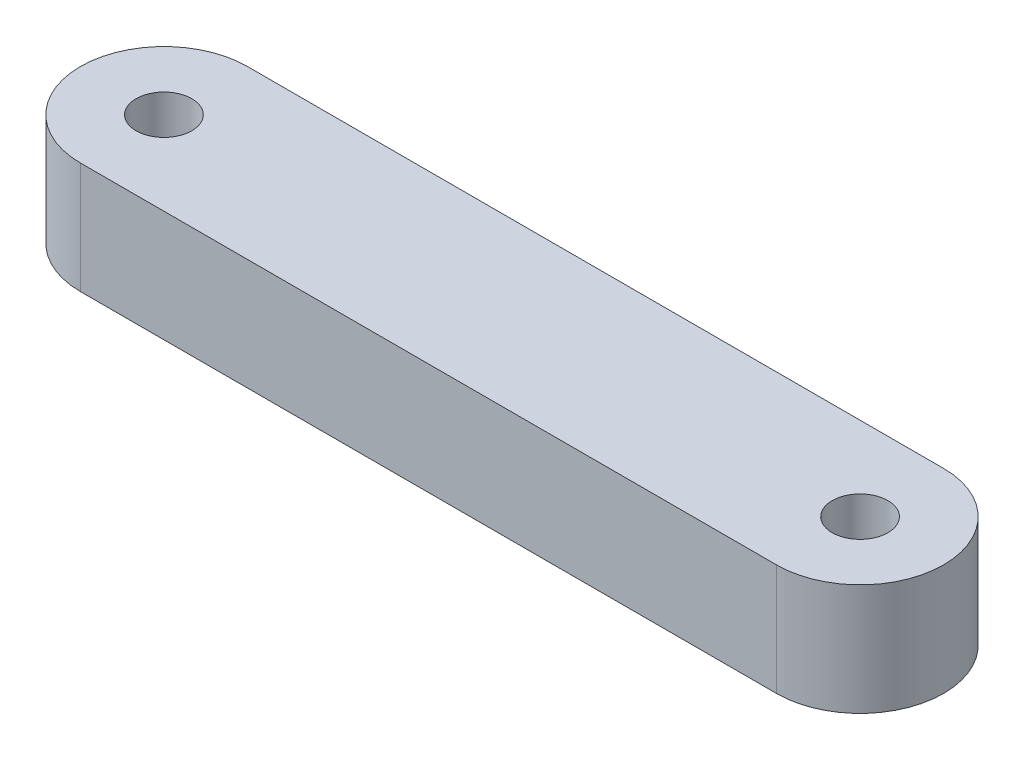
ISO-10303-21;
HEADER;
FILE_DESCRIPTION(('STEP AP214'),'2;1');
FILE_NAME('part.step','',(''),(''),'','','');
FILE_SCHEMA(('AUTOMOTIVE_DESIGN { 1 0 10303 214 1 1 1 1 }'));
ENDSEC;
DATA;
#1=APPLICATION_CONTEXT('core data for automotive mechanical design processes');
#2=APPLICATION_PROTOCOL_DEFINITION('international standard','automotive_design',2000,#1);
#3=PRODUCT_CONTEXT('',#1,'mechanical');
#4=PRODUCT('Part','Part','',(#3));
#5=PRODUCT_RELATED_PRODUCT_CATEGORY('part','',(#4));
#6=PRODUCT_DEFINITION_FORMATION('','',#4);
#7=PRODUCT_DEFINITION_CONTEXT('part definition',#1,'design');
#8=PRODUCT_DEFINITION('design','',#6,#7);
#9=PRODUCT_DEFINITION_SHAPE('','',#8);
#10=(LENGTH_UNIT() NAMED_UNIT(*) SI_UNIT(.MILLI.,.METRE.));
#11=(NAMED_UNIT(*) PLANE_ANGLE_UNIT() SI_UNIT($,.RADIAN.));
#12=(NAMED_UNIT(*) SI_UNIT($,.STERADIAN.) SOLID_ANGLE_UNIT());
#13=UNCERTAINTY_MEASURE_WITH_UNIT(LENGTH_MEASURE(1.E-05),#10,'distance_accuracy_value','');
#14=(GEOMETRIC_REPRESENTATION_CONTEXT(3) GLOBAL_UNCERTAINTY_ASSIGNED_CONTEXT((#13)) GLOBAL_UNIT_ASSIGNED_CONTEXT((#10,
#11,#12)) REPRESENTATION_CONTEXT('',''));
#15=CARTESIAN_POINT('',(0.,0.,0.));
#16=DIRECTION('',(0.,0.,1.));
#17=DIRECTION('',(1.,0.,0.));
#18=AXIS2_PLACEMENT_3D('',#15,#16,#17);
#19=CARTESIAN_POINT('',(0.,4.,0.));
#20=DIRECTION('',(0.,1.,0.));
#21=DIRECTION('',(0.,0.,1.));
#22=AXIS2_PLACEMENT_3D('',#19,#20,#21);
#23=PLANE('',#22);
#24=CARTESIAN_POINT('',(25.,4.,0.));
#25=DIRECTION('',(0.,1.,0.));
#26=DIRECTION('',(0.,0.,1.));
#27=AXIS2_PLACEMENT_3D('',#24,#25,#26);
#28=CIRCLE('',#27,1.);
#29=CARTESIAN_POINT('',(25.,4.,1.));
#30=VERTEX_POINT('',#29);
#31=EDGE_CURVE('E99',#30,#30,#28,.T.);
#32=ORIENTED_EDGE('',*,*,#31,.F.);
#33=EDGE_LOOP('',(#32));
#34=FACE_BOUND('',#33,.T.);
#35=CARTESIAN_POINT('',(0.,4.,0.));
#36=DIRECTION('',(0.,1.,0.));
#37=DIRECTION('',(0.,0.,1.));
#38=AXIS2_PLACEMENT_3D('',#35,#36,#37);
#39=CIRCLE('',#38,3.);
#40=CARTESIAN_POINT('',(0.,4.,-3.));
#41=VERTEX_POINT('',#40);
#42=CARTESIAN_POINT('',(0.,4.,3.));
#43=VERTEX_POINT('',#42);
#44=EDGE_CURVE('E84',#41,#43,#39,.T.);
#45=ORIENTED_EDGE('',*,*,#44,.T.);
#46=DIRECTION('',(1.,0.,0.));
#47=VECTOR('',#46,1.);
#48=CARTESIAN_POINT('',(0.,4.,3.));
#49=LINE('',#48,#47);
#50=CARTESIAN_POINT('',(25.,4.,3.));
#51=VERTEX_POINT('',#50);
#52=EDGE_CURVE('E79',#43,#51,#49,.T.);
#53=ORIENTED_EDGE('',*,*,#52,.T.);
#54=CARTESIAN_POINT('',(25.,4.,0.));
#55=DIRECTION('',(0.,1.,0.));
#56=DIRECTION('',(0.,0.,1.));
#57=AXIS2_PLACEMENT_3D('',#54,#55,#56);
#58=CIRCLE('',#57,3.);
#59=CARTESIAN_POINT('',(25.,4.,-3.));
#60=VERTEX_POINT('',#59);
#61=EDGE_CURVE('E82',#51,#60,#58,.T.);
#62=ORIENTED_EDGE('',*,*,#61,.T.);
#63=DIRECTION('',(-1.,0.,0.));
#64=VECTOR('',#63,1.);
#65=CARTESIAN_POINT('',(0.,4.,-3.));
#66=LINE('',#65,#64);
#67=EDGE_CURVE('E49',#60,#41,#66,.T.);
#68=ORIENTED_EDGE('',*,*,#67,.T.);
#69=EDGE_LOOP('',(#45,#53,#62,#68));
#70=FACE_BOUND('',#69,.T.);
#71=CARTESIAN_POINT('',(0.,4.,0.));
#72=DIRECTION('',(0.,1.,0.));
#73=DIRECTION('',(0.,0.,1.));
#74=AXIS2_PLACEMENT_3D('',#71,#72,#73);
#75=CIRCLE('',#74,1.);
#76=CARTESIAN_POINT('',(0.,4.,1.));
#77=VERTEX_POINT('',#76);
#78=EDGE_CURVE('E114',#77,#77,#75,.T.);
#79=ORIENTED_EDGE('',*,*,#78,.F.);
#80=EDGE_LOOP('',(#79));
#81=FACE_BOUND('',#80,.T.);
#82=ADVANCED_FACE('F32',(#34,#70,#81),#23,.T.);
#83=CARTESIAN_POINT('',(0.,0.,0.));
#84=DIRECTION('',(0.,1.,0.));
#85=DIRECTION('',(0.,0.,1.));
#86=AXIS2_PLACEMENT_3D('',#83,#84,#85);
#87=PLANE('',#86);
#88=CARTESIAN_POINT('',(0.,0.,0.));
#89=DIRECTION('',(0.,1.,0.));
#90=DIRECTION('',(0.,0.,1.));
#91=AXIS2_PLACEMENT_3D('',#88,#89,#90);
#92=CIRCLE('',#91,3.);
#93=CARTESIAN_POINT('',(0.,0.,-3.));
#94=VERTEX_POINT('',#93);
#95=CARTESIAN_POINT('',(0.,0.,3.));
#96=VERTEX_POINT('',#95);
#97=EDGE_CURVE('E96',#94,#96,#92,.T.);
#98=ORIENTED_EDGE('',*,*,#97,.F.);
#99=DIRECTION('',(-1.,0.,0.));
#100=VECTOR('',#99,1.);
#101=CARTESIAN_POINT('',(0.,0.,-3.));
#102=LINE('',#101,#100);
#103=CARTESIAN_POINT('',(25.,0.,-3.));
#104=VERTEX_POINT('',#103);
#105=EDGE_CURVE('E72',#104,#94,#102,.T.);
#106=ORIENTED_EDGE('',*,*,#105,.F.);
#107=CARTESIAN_POINT('',(25.,0.,0.));
#108=DIRECTION('',(0.,1.,0.));
#109=DIRECTION('',(0.,0.,1.));
#110=AXIS2_PLACEMENT_3D('',#107,#108,#109);
#111=CIRCLE('',#110,3.);
#112=CARTESIAN_POINT('',(25.,0.,3.));
#113=VERTEX_POINT('',#112);
#114=EDGE_CURVE('E66',#113,#104,#111,.T.);
#115=ORIENTED_EDGE('',*,*,#114,.F.);
#116=DIRECTION('',(1.,0.,0.));
#117=VECTOR('',#116,1.);
#118=CARTESIAN_POINT('',(0.,0.,3.));
#119=LINE('',#118,#117);
#120=EDGE_CURVE('E88',#96,#113,#119,.T.);
#121=ORIENTED_EDGE('',*,*,#120,.F.);
#122=EDGE_LOOP('',(#98,#106,#115,#121));
#123=FACE_BOUND('',#122,.T.);
#124=CARTESIAN_POINT('',(25.,0.,0.));
#125=DIRECTION('',(0.,1.,0.));
#126=DIRECTION('',(0.,0.,1.));
#127=AXIS2_PLACEMENT_3D('',#124,#125,#126);
#128=CIRCLE('',#127,1.);
#129=CARTESIAN_POINT('',(25.,0.,1.));
#130=VERTEX_POINT('',#129);
#131=EDGE_CURVE('E111',#130,#130,#128,.T.);
#132=ORIENTED_EDGE('',*,*,#131,.T.);
#133=EDGE_LOOP('',(#132));
#134=FACE_BOUND('',#133,.T.);
#135=CARTESIAN_POINT('',(0.,0.,0.));
#136=DIRECTION('',(0.,1.,0.));
#137=DIRECTION('',(0.,0.,1.));
#138=AXIS2_PLACEMENT_3D('',#135,#136,#137);
#139=CIRCLE('',#138,1.);
#140=CARTESIAN_POINT('',(0.,0.,1.));
#141=VERTEX_POINT('',#140);
#142=EDGE_CURVE('E117',#141,#141,#139,.T.);
#143=ORIENTED_EDGE('',*,*,#142,.T.);
#144=EDGE_LOOP('',(#143));
#145=FACE_BOUND('',#144,.T.);
#146=ADVANCED_FACE('F107',(#123,#134,#145),#87,.F.);
#147=CARTESIAN_POINT('',(0.,4.,0.));
#148=DIRECTION('',(0.,-1.,0.));
#149=DIRECTION('',(0.,0.,-1.));
#150=AXIS2_PLACEMENT_3D('',#147,#148,#149);
#151=CYLINDRICAL_SURFACE('',#150,3.);
#152=ORIENTED_EDGE('',*,*,#97,.T.);
#153=DIRECTION('',(0.,-1.,0.));
#154=VECTOR('',#153,1.);
#155=CARTESIAN_POINT('',(0.,4.,3.));
#156=LINE('',#155,#154);
#157=EDGE_CURVE('E11',#43,#96,#156,.T.);
#158=ORIENTED_EDGE('',*,*,#157,.F.);
#159=ORIENTED_EDGE('',*,*,#44,.F.);
#160=DIRECTION('',(0.,-1.,0.));
#161=VECTOR('',#160,1.);
#162=CARTESIAN_POINT('',(0.,4.,-3.));
#163=LINE('',#162,#161);
#164=EDGE_CURVE('E92',#41,#94,#163,.T.);
#165=ORIENTED_EDGE('',*,*,#164,.T.);
#166=EDGE_LOOP('',(#152,#158,#159,#165));
#167=FACE_BOUND('',#166,.T.);
#168=ADVANCED_FACE('F34',(#167),#151,.T.);
#169=CARTESIAN_POINT('',(0.,4.,3.));
#170=DIRECTION('',(0.,0.,-1.));
#171=DIRECTION('',(-1.,0.,0.));
#172=AXIS2_PLACEMENT_3D('',#169,#170,#171);
#173=PLANE('',#172);
#174=ORIENTED_EDGE('',*,*,#120,.T.);
#175=DIRECTION('',(0.,-1.,0.));
#176=VECTOR('',#175,1.);
#177=CARTESIAN_POINT('',(25.,4.,3.));
#178=LINE('',#177,#176);
#179=EDGE_CURVE('E41',#51,#113,#178,.T.);
#180=ORIENTED_EDGE('',*,*,#179,.F.);
#181=ORIENTED_EDGE('',*,*,#52,.F.);
#182=ORIENTED_EDGE('',*,*,#157,.T.);
#183=EDGE_LOOP('',(#174,#180,#181,#182));
#184=FACE_BOUND('',#183,.T.);
#185=ADVANCED_FACE('F87',(#184),#173,.F.);
#186=CARTESIAN_POINT('',(25.,4.,0.));
#187=DIRECTION('',(0.,-1.,0.));
#188=DIRECTION('',(0.,0.,-1.));
#189=AXIS2_PLACEMENT_3D('',#186,#187,#188);
#190=CYLINDRICAL_SURFACE('',#189,3.);
#191=ORIENTED_EDGE('',*,*,#114,.T.);
#192=DIRECTION('',(0.,-1.,0.));
#193=VECTOR('',#192,1.);
#194=CARTESIAN_POINT('',(25.,4.,-3.));
#195=LINE('',#194,#193);
#196=EDGE_CURVE('E89',#60,#104,#195,.T.);
#197=ORIENTED_EDGE('',*,*,#196,.F.);
#198=ORIENTED_EDGE('',*,*,#61,.F.);
#199=ORIENTED_EDGE('',*,*,#179,.T.);
#200=EDGE_LOOP('',(#191,#197,#198,#199));
#201=FACE_BOUND('',#200,.T.);
#202=ADVANCED_FACE('F90',(#201),#190,.T.);
#203=CARTESIAN_POINT('',(0.,4.,-3.));
#204=DIRECTION('',(0.,0.,1.));
#205=DIRECTION('',(1.,0.,0.));
#206=AXIS2_PLACEMENT_3D('',#203,#204,#205);
#207=PLANE('',#206);
#208=ORIENTED_EDGE('',*,*,#105,.T.);
#209=ORIENTED_EDGE('',*,*,#164,.F.);
#210=ORIENTED_EDGE('',*,*,#67,.F.);
#211=ORIENTED_EDGE('',*,*,#196,.T.);
#212=EDGE_LOOP('',(#208,#209,#210,#211));
#213=FACE_BOUND('',#212,.T.);
#214=ADVANCED_FACE('F104',(#213),#207,.F.);
#215=CARTESIAN_POINT('',(25.,4.,0.));
#216=DIRECTION('',(0.,-1.,0.));
#217=DIRECTION('',(0.,0.,-1.));
#218=AXIS2_PLACEMENT_3D('',#215,#216,#217);
#219=CYLINDRICAL_SURFACE('',#218,1.);
#220=ORIENTED_EDGE('',*,*,#31,.T.);
#221=EDGE_LOOP('',(#220));
#222=FACE_BOUND('',#221,.T.);
#223=ORIENTED_EDGE('',*,*,#131,.F.);
#224=EDGE_LOOP('',(#223));
#225=FACE_BOUND('',#224,.T.);
#226=ADVANCED_FACE('F134',(#222,#225),#219,.F.);
#227=CARTESIAN_POINT('',(0.,4.,0.));
#228=DIRECTION('',(0.,-1.,0.));
#229=DIRECTION('',(0.,0.,-1.));
#230=AXIS2_PLACEMENT_3D('',#227,#228,#229);
#231=CYLINDRICAL_SURFACE('',#230,1.);
#232=ORIENTED_EDGE('',*,*,#78,.T.);
#233=EDGE_LOOP('',(#232));
#234=FACE_BOUND('',#233,.T.);
#235=ORIENTED_EDGE('',*,*,#142,.F.);
#236=EDGE_LOOP('',(#235));
#237=FACE_BOUND('',#236,.T.);
#238=ADVANCED_FACE('F123',(#234,#237),#231,.F.);
#239=CLOSED_SHELL('',(#82,#146,#168,#185,#202,#214,#226,#238));
#240=MANIFOLD_SOLID_BREP('B2',#239);
#241=ADVANCED_BREP_SHAPE_REPRESENTATION('',(#18,#240),#14);
#242=SHAPE_DEFINITION_REPRESENTATION(#9,#241);
ENDSEC;
END-ISO-10303-21;
